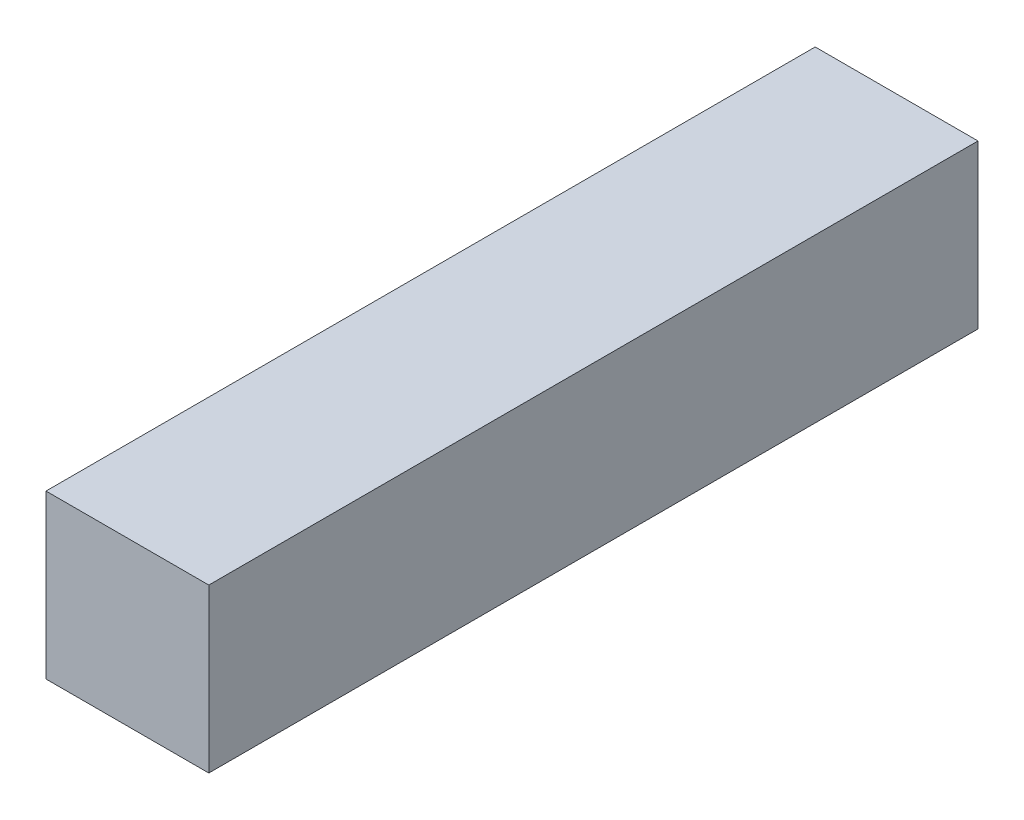
ISO-10303-21;
HEADER;
FILE_DESCRIPTION(('STEP AP214'),'2;1');
FILE_NAME('part.step','',(''),(''),'','','');
FILE_SCHEMA(('AUTOMOTIVE_DESIGN { 1 0 10303 214 1 1 1 1 }'));
ENDSEC;
DATA;
#1=APPLICATION_CONTEXT('core data for automotive mechanical design processes');
#2=APPLICATION_PROTOCOL_DEFINITION('international standard','automotive_design',2000,#1);
#3=PRODUCT_CONTEXT('',#1,'mechanical');
#4=PRODUCT('Part','Part','',(#3));
#5=PRODUCT_RELATED_PRODUCT_CATEGORY('part','',(#4));
#6=PRODUCT_DEFINITION_FORMATION('','',#4);
#7=PRODUCT_DEFINITION_CONTEXT('part definition',#1,'design');
#8=PRODUCT_DEFINITION('design','',#6,#7);
#9=PRODUCT_DEFINITION_SHAPE('','',#8);
#10=(LENGTH_UNIT() NAMED_UNIT(*) SI_UNIT(.MILLI.,.METRE.));
#11=(NAMED_UNIT(*) PLANE_ANGLE_UNIT() SI_UNIT($,.RADIAN.));
#12=(NAMED_UNIT(*) SI_UNIT($,.STERADIAN.) SOLID_ANGLE_UNIT());
#13=UNCERTAINTY_MEASURE_WITH_UNIT(LENGTH_MEASURE(1.E-05),#10,'distance_accuracy_value','');
#14=(GEOMETRIC_REPRESENTATION_CONTEXT(3) GLOBAL_UNCERTAINTY_ASSIGNED_CONTEXT((#13)) GLOBAL_UNIT_ASSIGNED_CONTEXT((#10,
#11,#12)) REPRESENTATION_CONTEXT('',''));
#15=CARTESIAN_POINT('',(0.,0.,0.));
#16=DIRECTION('',(0.,0.,1.));
#17=DIRECTION('',(1.,0.,0.));
#18=AXIS2_PLACEMENT_3D('',#15,#16,#17);
#19=CARTESIAN_POINT('',(-3.175,-3.175,30.));
#20=DIRECTION('',(1.,0.,0.));
#21=DIRECTION('',(0.,0.,-1.));
#22=AXIS2_PLACEMENT_3D('',#19,#20,#21);
#23=PLANE('',#22);
#24=DIRECTION('',(0.,-1.,0.));
#25=VECTOR('',#24,1.);
#26=CARTESIAN_POINT('',(-3.175,-3.175,0.));
#27=LINE('',#26,#25);
#28=CARTESIAN_POINT('',(-3.175,3.175,0.));
#29=VERTEX_POINT('',#28);
#30=CARTESIAN_POINT('',(-3.175,-3.175,0.));
#31=VERTEX_POINT('',#30);
#32=EDGE_CURVE('E96',#29,#31,#27,.T.);
#33=ORIENTED_EDGE('',*,*,#32,.T.);
#34=DIRECTION('',(0.,0.,-1.));
#35=VECTOR('',#34,1.);
#36=CARTESIAN_POINT('',(-3.175,-3.175,30.));
#37=LINE('',#36,#35);
#38=CARTESIAN_POINT('',(-3.175,-3.175,30.));
#39=VERTEX_POINT('',#38);
#40=EDGE_CURVE('E11',#39,#31,#37,.T.);
#41=ORIENTED_EDGE('',*,*,#40,.F.);
#42=DIRECTION('',(0.,-1.,0.));
#43=VECTOR('',#42,1.);
#44=CARTESIAN_POINT('',(-3.175,-3.175,30.));
#45=LINE('',#44,#43);
#46=CARTESIAN_POINT('',(-3.175,3.175,30.));
#47=VERTEX_POINT('',#46);
#48=EDGE_CURVE('E84',#47,#39,#45,.T.);
#49=ORIENTED_EDGE('',*,*,#48,.F.);
#50=DIRECTION('',(0.,0.,-1.));
#51=VECTOR('',#50,1.);
#52=CARTESIAN_POINT('',(-3.175,3.175,30.));
#53=LINE('',#52,#51);
#54=EDGE_CURVE('E92',#47,#29,#53,.T.);
#55=ORIENTED_EDGE('',*,*,#54,.T.);
#56=EDGE_LOOP('',(#33,#41,#49,#55));
#57=FACE_BOUND('',#56,.T.);
#58=ADVANCED_FACE('F33',(#57),#23,.F.);
#59=CARTESIAN_POINT('',(3.175,-3.175,30.));
#60=DIRECTION('',(0.,1.,0.));
#61=DIRECTION('',(-1.,0.,0.));
#62=AXIS2_PLACEMENT_3D('',#59,#60,#61);
#63=PLANE('',#62);
#64=DIRECTION('',(1.,0.,0.));
#65=VECTOR('',#64,1.);
#66=CARTESIAN_POINT('',(3.175,-3.175,0.));
#67=LINE('',#66,#65);
#68=CARTESIAN_POINT('',(3.175,-3.175,0.));
#69=VERTEX_POINT('',#68);
#70=EDGE_CURVE('E88',#31,#69,#67,.T.);
#71=ORIENTED_EDGE('',*,*,#70,.T.);
#72=DIRECTION('',(0.,0.,-1.));
#73=VECTOR('',#72,1.);
#74=CARTESIAN_POINT('',(3.175,-3.175,30.));
#75=LINE('',#74,#73);
#76=CARTESIAN_POINT('',(3.175,-3.175,30.));
#77=VERTEX_POINT('',#76);
#78=EDGE_CURVE('E41',#77,#69,#75,.T.);
#79=ORIENTED_EDGE('',*,*,#78,.F.);
#80=DIRECTION('',(1.,0.,0.));
#81=VECTOR('',#80,1.);
#82=CARTESIAN_POINT('',(3.175,-3.175,30.));
#83=LINE('',#82,#81);
#84=EDGE_CURVE('E79',#39,#77,#83,.T.);
#85=ORIENTED_EDGE('',*,*,#84,.F.);
#86=ORIENTED_EDGE('',*,*,#40,.T.);
#87=EDGE_LOOP('',(#71,#79,#85,#86));
#88=FACE_BOUND('',#87,.T.);
#89=ADVANCED_FACE('F87',(#88),#63,.F.);
#90=CARTESIAN_POINT('',(3.175,-3.175,30.));
#91=DIRECTION('',(-1.,0.,0.));
#92=DIRECTION('',(0.,0.,1.));
#93=AXIS2_PLACEMENT_3D('',#90,#91,#92);
#94=PLANE('',#93);
#95=DIRECTION('',(0.,1.,0.));
#96=VECTOR('',#95,1.);
#97=CARTESIAN_POINT('',(3.175,-3.175,0.));
#98=LINE('',#97,#96);
#99=CARTESIAN_POINT('',(3.175,3.175,0.));
#100=VERTEX_POINT('',#99);
#101=EDGE_CURVE('E66',#69,#100,#98,.T.);
#102=ORIENTED_EDGE('',*,*,#101,.T.);
#103=DIRECTION('',(0.,0.,-1.));
#104=VECTOR('',#103,1.);
#105=CARTESIAN_POINT('',(3.175,3.175,30.));
#106=LINE('',#105,#104);
#107=CARTESIAN_POINT('',(3.175,3.175,30.));
#108=VERTEX_POINT('',#107);
#109=EDGE_CURVE('E89',#108,#100,#106,.T.);
#110=ORIENTED_EDGE('',*,*,#109,.F.);
#111=DIRECTION('',(0.,1.,0.));
#112=VECTOR('',#111,1.);
#113=CARTESIAN_POINT('',(3.175,-3.175,30.));
#114=LINE('',#113,#112);
#115=EDGE_CURVE('E82',#77,#108,#114,.T.);
#116=ORIENTED_EDGE('',*,*,#115,.F.);
#117=ORIENTED_EDGE('',*,*,#78,.T.);
#118=EDGE_LOOP('',(#102,#110,#116,#117));
#119=FACE_BOUND('',#118,.T.);
#120=ADVANCED_FACE('F90',(#119),#94,.F.);
#121=CARTESIAN_POINT('',(3.175,3.175,30.));
#122=DIRECTION('',(0.,-1.,0.));
#123=DIRECTION('',(1.,0.,0.));
#124=AXIS2_PLACEMENT_3D('',#121,#122,#123);
#125=PLANE('',#124);
#126=DIRECTION('',(-1.,0.,0.));
#127=VECTOR('',#126,1.);
#128=CARTESIAN_POINT('',(3.175,3.175,0.));
#129=LINE('',#128,#127);
#130=EDGE_CURVE('E72',#100,#29,#129,.T.);
#131=ORIENTED_EDGE('',*,*,#130,.T.);
#132=ORIENTED_EDGE('',*,*,#54,.F.);
#133=DIRECTION('',(-1.,0.,0.));
#134=VECTOR('',#133,1.);
#135=CARTESIAN_POINT('',(3.175,3.175,30.));
#136=LINE('',#135,#134);
#137=EDGE_CURVE('E49',#108,#47,#136,.T.);
#138=ORIENTED_EDGE('',*,*,#137,.F.);
#139=ORIENTED_EDGE('',*,*,#109,.T.);
#140=EDGE_LOOP('',(#131,#132,#138,#139));
#141=FACE_BOUND('',#140,.T.);
#142=ADVANCED_FACE('F103',(#141),#125,.F.);
#143=CARTESIAN_POINT('',(0.,0.,30.));
#144=DIRECTION('',(0.,0.,1.));
#145=DIRECTION('',(1.,0.,0.));
#146=AXIS2_PLACEMENT_3D('',#143,#144,#145);
#147=PLANE('',#146);
#148=ORIENTED_EDGE('',*,*,#48,.T.);
#149=ORIENTED_EDGE('',*,*,#84,.T.);
#150=ORIENTED_EDGE('',*,*,#115,.T.);
#151=ORIENTED_EDGE('',*,*,#137,.T.);
#152=EDGE_LOOP('',(#148,#149,#150,#151));
#153=FACE_BOUND('',#152,.T.);
#154=ADVANCED_FACE('F80',(#153),#147,.T.);
#155=CARTESIAN_POINT('',(0.,0.,0.));
#156=DIRECTION('',(0.,0.,1.));
#157=DIRECTION('',(1.,0.,0.));
#158=AXIS2_PLACEMENT_3D('',#155,#156,#157);
#159=PLANE('',#158);
#160=ORIENTED_EDGE('',*,*,#32,.F.);
#161=ORIENTED_EDGE('',*,*,#130,.F.);
#162=ORIENTED_EDGE('',*,*,#101,.F.);
#163=ORIENTED_EDGE('',*,*,#70,.F.);
#164=EDGE_LOOP('',(#160,#161,#162,#163));
#165=FACE_BOUND('',#164,.T.);
#166=ADVANCED_FACE('F106',(#165),#159,.F.);
#167=CLOSED_SHELL('',(#58,#89,#120,#142,#154,#166));
#168=MANIFOLD_SOLID_BREP('B2',#167);
#169=ADVANCED_BREP_SHAPE_REPRESENTATION('',(#18,#168),#14);
#170=SHAPE_DEFINITION_REPRESENTATION(#9,#169);
ENDSEC;
END-ISO-10303-21;
